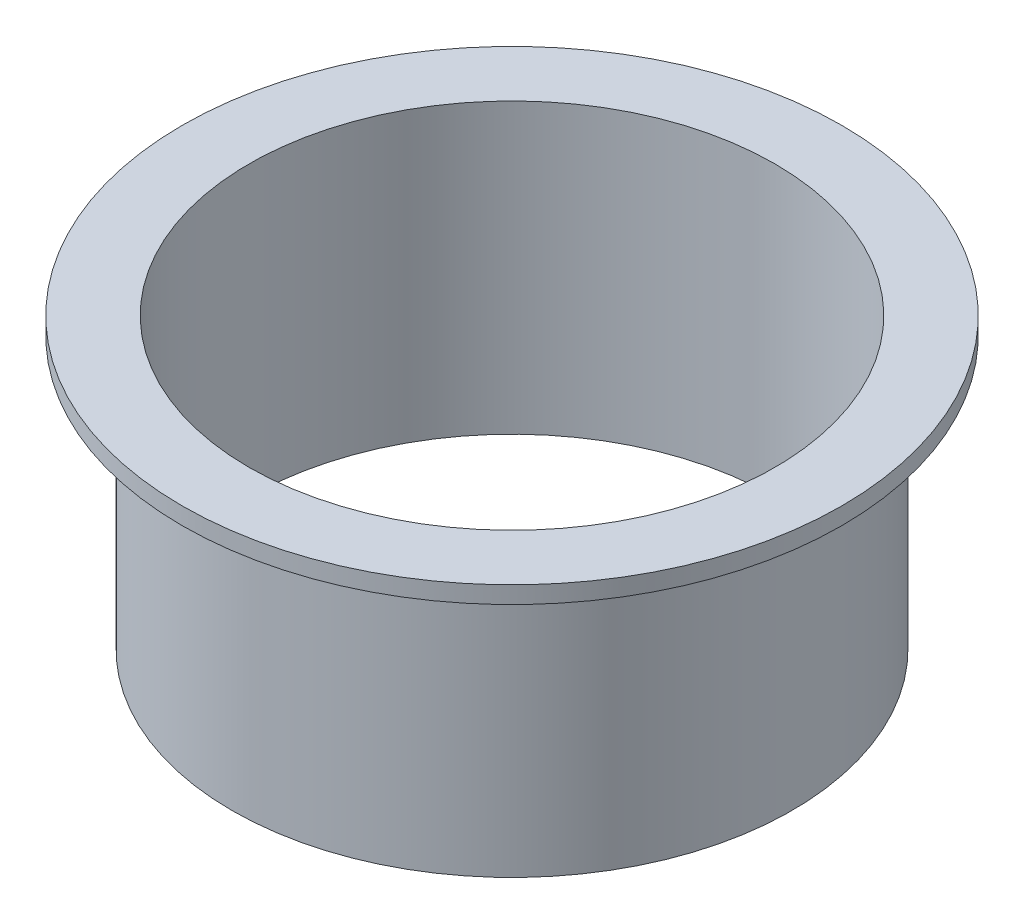
ISO-10303-21;
HEADER;
FILE_DESCRIPTION(('STEP AP214'),'2;1');
FILE_NAME('part.step','',(''),(''),'','','');
FILE_SCHEMA(('AUTOMOTIVE_DESIGN { 1 0 10303 214 1 1 1 1 }'));
ENDSEC;
DATA;
#1=APPLICATION_CONTEXT('core data for automotive mechanical design processes');
#2=APPLICATION_PROTOCOL_DEFINITION('international standard','automotive_design',2000,#1);
#3=PRODUCT_CONTEXT('',#1,'mechanical');
#4=PRODUCT('Part','Part','',(#3));
#5=PRODUCT_RELATED_PRODUCT_CATEGORY('part','',(#4));
#6=PRODUCT_DEFINITION_FORMATION('','',#4);
#7=PRODUCT_DEFINITION_CONTEXT('part definition',#1,'design');
#8=PRODUCT_DEFINITION('design','',#6,#7);
#9=PRODUCT_DEFINITION_SHAPE('','',#8);
#10=(LENGTH_UNIT() NAMED_UNIT(*) SI_UNIT(.MILLI.,.METRE.));
#11=(NAMED_UNIT(*) PLANE_ANGLE_UNIT() SI_UNIT($,.RADIAN.));
#12=(NAMED_UNIT(*) SI_UNIT($,.STERADIAN.) SOLID_ANGLE_UNIT());
#13=UNCERTAINTY_MEASURE_WITH_UNIT(LENGTH_MEASURE(1.E-05),#10,'distance_accuracy_value','');
#14=(GEOMETRIC_REPRESENTATION_CONTEXT(3) GLOBAL_UNCERTAINTY_ASSIGNED_CONTEXT((#13)) GLOBAL_UNIT_ASSIGNED_CONTEXT((#10,
#11,#12)) REPRESENTATION_CONTEXT('',''));
#15=CARTESIAN_POINT('',(0.,0.,0.));
#16=DIRECTION('',(0.,0.,1.));
#17=DIRECTION('',(1.,0.,0.));
#18=AXIS2_PLACEMENT_3D('',#15,#16,#17);
#19=CARTESIAN_POINT('',(0.,33.7,0.));
#20=DIRECTION('',(0.,-1.,0.));
#21=DIRECTION('',(0.,0.,-1.));
#22=AXIS2_PLACEMENT_3D('',#19,#20,#21);
#23=CYLINDRICAL_SURFACE('',#22,32.7);
#24=CARTESIAN_POINT('',(0.,0.,0.));
#25=DIRECTION('',(0.,1.,0.));
#26=DIRECTION('',(0.,0.,1.));
#27=AXIS2_PLACEMENT_3D('',#24,#25,#26);
#28=CIRCLE('',#27,32.7);
#29=CARTESIAN_POINT('',(0.,0.,32.7));
#30=VERTEX_POINT('',#29);
#31=EDGE_CURVE('E35',#30,#30,#28,.T.);
#32=ORIENTED_EDGE('',*,*,#31,.T.);
#33=EDGE_LOOP('',(#32));
#34=FACE_BOUND('',#33,.T.);
#35=CARTESIAN_POINT('',(0.,31.7,0.));
#36=DIRECTION('',(0.,1.,0.));
#37=DIRECTION('',(0.,0.,1.));
#38=AXIS2_PLACEMENT_3D('',#35,#36,#37);
#39=CIRCLE('',#38,32.7);
#40=CARTESIAN_POINT('',(0.,31.7,32.7));
#41=VERTEX_POINT('',#40);
#42=EDGE_CURVE('E10',#41,#41,#39,.T.);
#43=ORIENTED_EDGE('',*,*,#42,.F.);
#44=EDGE_LOOP('',(#43));
#45=FACE_BOUND('',#44,.T.);
#46=ADVANCED_FACE('F32',(#34,#45),#23,.T.);
#47=CARTESIAN_POINT('',(0.,33.7,0.));
#48=DIRECTION('',(0.,1.,0.));
#49=DIRECTION('',(0.,0.,1.));
#50=AXIS2_PLACEMENT_3D('',#47,#48,#49);
#51=PLANE('',#50);
#52=CARTESIAN_POINT('',(0.,33.7,0.));
#53=DIRECTION('',(0.,1.,0.));
#54=DIRECTION('',(0.,0.,1.));
#55=AXIS2_PLACEMENT_3D('',#52,#53,#54);
#56=CIRCLE('',#55,30.7);
#57=CARTESIAN_POINT('',(0.,33.7,30.7));
#58=VERTEX_POINT('',#57);
#59=EDGE_CURVE('E43',#58,#58,#56,.T.);
#60=ORIENTED_EDGE('',*,*,#59,.F.);
#61=EDGE_LOOP('',(#60));
#62=FACE_BOUND('',#61,.T.);
#63=CARTESIAN_POINT('',(0.,33.7,0.));
#64=DIRECTION('',(0.,1.,0.));
#65=DIRECTION('',(0.,0.,1.));
#66=AXIS2_PLACEMENT_3D('',#63,#64,#65);
#67=CIRCLE('',#66,38.5);
#68=CARTESIAN_POINT('',(0.,33.7,38.5));
#69=VERTEX_POINT('',#68);
#70=EDGE_CURVE('E46',#69,#69,#67,.T.);
#71=ORIENTED_EDGE('',*,*,#70,.T.);
#72=EDGE_LOOP('',(#71));
#73=FACE_BOUND('',#72,.T.);
#74=ADVANCED_FACE('F60',(#62,#73),#51,.T.);
#75=CARTESIAN_POINT('',(0.,0.,0.));
#76=DIRECTION('',(0.,1.,0.));
#77=DIRECTION('',(0.,0.,1.));
#78=AXIS2_PLACEMENT_3D('',#75,#76,#77);
#79=PLANE('',#78);
#80=ORIENTED_EDGE('',*,*,#31,.F.);
#81=EDGE_LOOP('',(#80));
#82=FACE_BOUND('',#81,.T.);
#83=CARTESIAN_POINT('',(0.,0.,0.));
#84=DIRECTION('',(0.,1.,0.));
#85=DIRECTION('',(0.,0.,1.));
#86=AXIS2_PLACEMENT_3D('',#83,#84,#85);
#87=CIRCLE('',#86,30.7);
#88=CARTESIAN_POINT('',(0.,0.,30.7));
#89=VERTEX_POINT('',#88);
#90=EDGE_CURVE('E49',#89,#89,#87,.T.);
#91=ORIENTED_EDGE('',*,*,#90,.T.);
#92=EDGE_LOOP('',(#91));
#93=FACE_BOUND('',#92,.T.);
#94=ADVANCED_FACE('F78',(#82,#93),#79,.F.);
#95=CARTESIAN_POINT('',(0.,33.7,0.));
#96=DIRECTION('',(0.,-1.,0.));
#97=DIRECTION('',(0.,0.,-1.));
#98=AXIS2_PLACEMENT_3D('',#95,#96,#97);
#99=CYLINDRICAL_SURFACE('',#98,30.7);
#100=ORIENTED_EDGE('',*,*,#59,.T.);
#101=EDGE_LOOP('',(#100));
#102=FACE_BOUND('',#101,.T.);
#103=ORIENTED_EDGE('',*,*,#90,.F.);
#104=EDGE_LOOP('',(#103));
#105=FACE_BOUND('',#104,.T.);
#106=ADVANCED_FACE('F69',(#102,#105),#99,.F.);
#107=CARTESIAN_POINT('',(0.,31.7,0.));
#108=DIRECTION('',(0.,1.,0.));
#109=DIRECTION('',(0.,0.,1.));
#110=AXIS2_PLACEMENT_3D('',#107,#108,#109);
#111=PLANE('',#110);
#112=CARTESIAN_POINT('',(0.,31.7,0.));
#113=DIRECTION('',(0.,1.,0.));
#114=DIRECTION('',(0.,0.,1.));
#115=AXIS2_PLACEMENT_3D('',#112,#113,#114);
#116=CIRCLE('',#115,38.5);
#117=CARTESIAN_POINT('',(0.,31.7,38.5));
#118=VERTEX_POINT('',#117);
#119=EDGE_CURVE('E51',#118,#118,#116,.T.);
#120=ORIENTED_EDGE('',*,*,#119,.F.);
#121=EDGE_LOOP('',(#120));
#122=FACE_BOUND('',#121,.T.);
#123=ORIENTED_EDGE('',*,*,#42,.T.);
#124=EDGE_LOOP('',(#123));
#125=FACE_BOUND('',#124,.T.);
#126=ADVANCED_FACE('F64',(#122,#125),#111,.F.);
#127=CARTESIAN_POINT('',(0.,31.7,0.));
#128=DIRECTION('',(0.,1.,0.));
#129=DIRECTION('',(0.,0.,1.));
#130=AXIS2_PLACEMENT_3D('',#127,#128,#129);
#131=CYLINDRICAL_SURFACE('',#130,38.5);
#132=ORIENTED_EDGE('',*,*,#119,.T.);
#133=EDGE_LOOP('',(#132));
#134=FACE_BOUND('',#133,.T.);
#135=ORIENTED_EDGE('',*,*,#70,.F.);
#136=EDGE_LOOP('',(#135));
#137=FACE_BOUND('',#136,.T.);
#138=ADVANCED_FACE('F62',(#134,#137),#131,.T.);
#139=CLOSED_SHELL('',(#46,#74,#94,#106,#126,#138));
#140=MANIFOLD_SOLID_BREP('B2',#139);
#141=ADVANCED_BREP_SHAPE_REPRESENTATION('',(#18,#140),#14);
#142=SHAPE_DEFINITION_REPRESENTATION(#9,#141);
ENDSEC;
END-ISO-10303-21;
